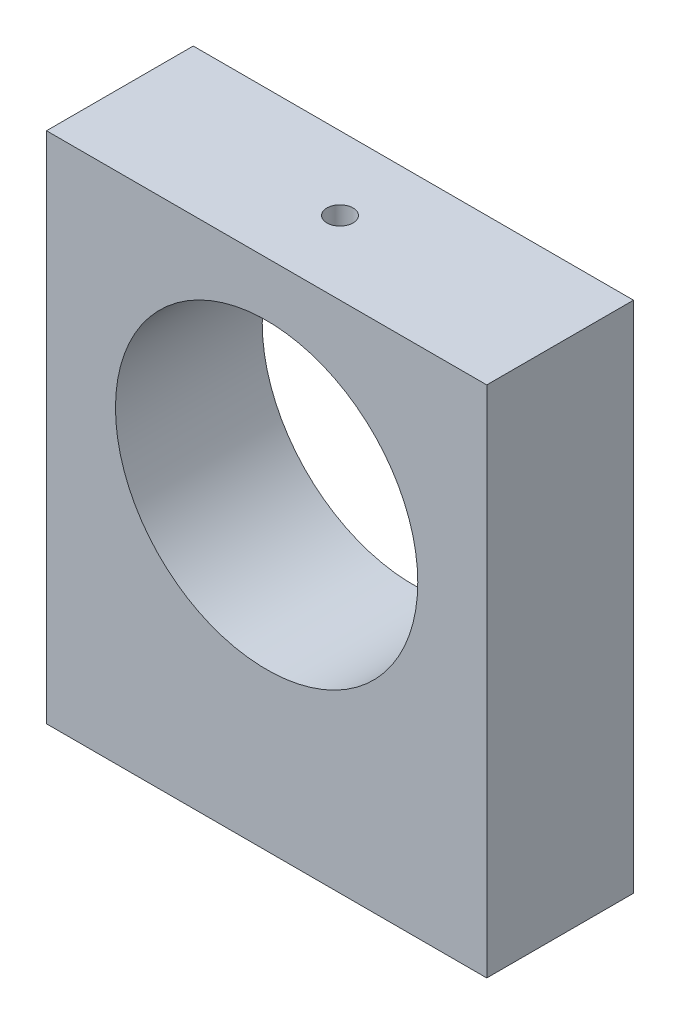
ISO-10303-21;
HEADER;
FILE_DESCRIPTION(('STEP AP214'),'2;1');
FILE_NAME('part.step','',(''),(''),'','','');
FILE_SCHEMA(('AUTOMOTIVE_DESIGN { 1 0 10303 214 1 1 1 1 }'));
ENDSEC;
DATA;
#1=APPLICATION_CONTEXT('core data for automotive mechanical design processes');
#2=APPLICATION_PROTOCOL_DEFINITION('international standard','automotive_design',2000,#1);
#3=PRODUCT_CONTEXT('',#1,'mechanical');
#4=PRODUCT('Part','Part','',(#3));
#5=PRODUCT_RELATED_PRODUCT_CATEGORY('part','',(#4));
#6=PRODUCT_DEFINITION_FORMATION('','',#4);
#7=PRODUCT_DEFINITION_CONTEXT('part definition',#1,'design');
#8=PRODUCT_DEFINITION('design','',#6,#7);
#9=PRODUCT_DEFINITION_SHAPE('','',#8);
#10=(LENGTH_UNIT() NAMED_UNIT(*) SI_UNIT(.MILLI.,.METRE.));
#11=(NAMED_UNIT(*) PLANE_ANGLE_UNIT() SI_UNIT($,.RADIAN.));
#12=(NAMED_UNIT(*) SI_UNIT($,.STERADIAN.) SOLID_ANGLE_UNIT());
#13=UNCERTAINTY_MEASURE_WITH_UNIT(LENGTH_MEASURE(1.E-05),#10,'distance_accuracy_value','');
#14=(GEOMETRIC_REPRESENTATION_CONTEXT(3) GLOBAL_UNCERTAINTY_ASSIGNED_CONTEXT((#13)) GLOBAL_UNIT_ASSIGNED_CONTEXT((#10,
#11,#12)) REPRESENTATION_CONTEXT('',''));
#15=CARTESIAN_POINT('',(0.,0.,0.));
#16=DIRECTION('',(0.,0.,1.));
#17=DIRECTION('',(1.,0.,0.));
#18=AXIS2_PLACEMENT_3D('',#15,#16,#17);
#19=CARTESIAN_POINT('',(19.05,44.45,12.7));
#20=DIRECTION('',(0.,0.,1.));
#21=DIRECTION('',(1.,0.,0.));
#22=AXIS2_PLACEMENT_3D('',#19,#20,#21);
#23=PLANE('',#22);
#24=DIRECTION('',(-1.,0.,0.));
#25=VECTOR('',#24,1.);
#26=CARTESIAN_POINT('',(-19.05,44.45,12.7));
#27=LINE('',#26,#25);
#28=CARTESIAN_POINT('',(19.05,44.45,12.7));
#29=VERTEX_POINT('',#28);
#30=CARTESIAN_POINT('',(-19.05,44.45,12.7));
#31=VERTEX_POINT('',#30);
#32=EDGE_CURVE('E178',#29,#31,#27,.T.);
#33=ORIENTED_EDGE('',*,*,#32,.T.);
#34=DIRECTION('',(0.,-1.,0.));
#35=VECTOR('',#34,1.);
#36=CARTESIAN_POINT('',(-19.05,0.,12.7));
#37=LINE('',#36,#35);
#38=CARTESIAN_POINT('',(-19.05,0.,12.7));
#39=VERTEX_POINT('',#38);
#40=EDGE_CURVE('E85',#31,#39,#37,.T.);
#41=ORIENTED_EDGE('',*,*,#40,.T.);
#42=DIRECTION('',(1.,0.,0.));
#43=VECTOR('',#42,1.);
#44=CARTESIAN_POINT('',(19.05,0.,12.7));
#45=LINE('',#44,#43);
#46=CARTESIAN_POINT('',(19.05,0.,12.7));
#47=VERTEX_POINT('',#46);
#48=EDGE_CURVE('E174',#39,#47,#45,.T.);
#49=ORIENTED_EDGE('',*,*,#48,.T.);
#50=DIRECTION('',(0.,1.,0.));
#51=VECTOR('',#50,1.);
#52=CARTESIAN_POINT('',(19.05,0.,12.7));
#53=LINE('',#52,#51);
#54=EDGE_CURVE('E54',#47,#29,#53,.T.);
#55=ORIENTED_EDGE('',*,*,#54,.T.);
#56=EDGE_LOOP('',(#33,#41,#49,#55));
#57=FACE_BOUND('',#56,.T.);
#58=CARTESIAN_POINT('',(0.,26.67,12.7));
#59=DIRECTION('',(0.,0.,1.));
#60=DIRECTION('',(1.,0.,0.));
#61=AXIS2_PLACEMENT_3D('',#58,#59,#60);
#62=CIRCLE('',#61,13.081);
#63=CARTESIAN_POINT('',(13.081,26.67,12.7));
#64=VERTEX_POINT('',#63);
#65=EDGE_CURVE('E124',#64,#64,#62,.T.);
#66=ORIENTED_EDGE('',*,*,#65,.F.);
#67=EDGE_LOOP('',(#66));
#68=FACE_BOUND('',#67,.T.);
#69=ADVANCED_FACE('F37',(#57,#68),#23,.T.);
#70=CARTESIAN_POINT('',(19.05,44.45,0.));
#71=DIRECTION('',(0.,0.,1.));
#72=DIRECTION('',(1.,0.,0.));
#73=AXIS2_PLACEMENT_3D('',#70,#71,#72);
#74=PLANE('',#73);
#75=DIRECTION('',(-1.,0.,0.));
#76=VECTOR('',#75,1.);
#77=CARTESIAN_POINT('',(-19.05,44.45,0.));
#78=LINE('',#77,#76);
#79=CARTESIAN_POINT('',(19.05,44.45,0.));
#80=VERTEX_POINT('',#79);
#81=CARTESIAN_POINT('',(-19.05,44.45,0.));
#82=VERTEX_POINT('',#81);
#83=EDGE_CURVE('E172',#80,#82,#78,.T.);
#84=ORIENTED_EDGE('',*,*,#83,.F.);
#85=DIRECTION('',(0.,1.,0.));
#86=VECTOR('',#85,1.);
#87=CARTESIAN_POINT('',(19.05,0.,0.));
#88=LINE('',#87,#86);
#89=CARTESIAN_POINT('',(19.05,0.,0.));
#90=VERTEX_POINT('',#89);
#91=EDGE_CURVE('E78',#90,#80,#88,.T.);
#92=ORIENTED_EDGE('',*,*,#91,.F.);
#93=DIRECTION('',(1.,0.,0.));
#94=VECTOR('',#93,1.);
#95=CARTESIAN_POINT('',(19.05,0.,0.));
#96=LINE('',#95,#94);
#97=CARTESIAN_POINT('',(-19.05,0.,0.));
#98=VERTEX_POINT('',#97);
#99=EDGE_CURVE('E72',#98,#90,#96,.T.);
#100=ORIENTED_EDGE('',*,*,#99,.F.);
#101=DIRECTION('',(0.,-1.,0.));
#102=VECTOR('',#101,1.);
#103=CARTESIAN_POINT('',(-19.05,0.,0.));
#104=LINE('',#103,#102);
#105=EDGE_CURVE('E167',#82,#98,#104,.T.);
#106=ORIENTED_EDGE('',*,*,#105,.F.);
#107=EDGE_LOOP('',(#84,#92,#100,#106));
#108=FACE_BOUND('',#107,.T.);
#109=CARTESIAN_POINT('',(0.,26.67,0.));
#110=DIRECTION('',(0.,0.,1.));
#111=DIRECTION('',(1.,0.,0.));
#112=AXIS2_PLACEMENT_3D('',#109,#110,#111);
#113=CIRCLE('',#112,13.081);
#114=CARTESIAN_POINT('',(13.081,26.67,0.));
#115=VERTEX_POINT('',#114);
#116=EDGE_CURVE('E123',#115,#115,#113,.T.);
#117=ORIENTED_EDGE('',*,*,#116,.T.);
#118=EDGE_LOOP('',(#117));
#119=FACE_BOUND('',#118,.T.);
#120=ADVANCED_FACE('F146',(#108,#119),#74,.F.);
#121=CARTESIAN_POINT('',(-19.05,44.45,12.7));
#122=DIRECTION('',(0.,-1.,0.));
#123=DIRECTION('',(1.,0.,0.));
#124=AXIS2_PLACEMENT_3D('',#121,#122,#123);
#125=PLANE('',#124);
#126=CARTESIAN_POINT('',(0.,44.45,6.35));
#127=DIRECTION('',(0.,1.,0.));
#128=DIRECTION('',(0.,0.,1.));
#129=AXIS2_PLACEMENT_3D('',#126,#127,#128);
#130=CIRCLE('',#129,1.1303);
#131=CARTESIAN_POINT('',(0.,44.45,7.4803));
#132=VERTEX_POINT('',#131);
#133=EDGE_CURVE('E113',#132,#132,#130,.T.);
#134=ORIENTED_EDGE('',*,*,#133,.F.);
#135=EDGE_LOOP('',(#134));
#136=FACE_BOUND('',#135,.T.);
#137=ORIENTED_EDGE('',*,*,#83,.T.);
#138=DIRECTION('',(0.,0.,-1.));
#139=VECTOR('',#138,1.);
#140=CARTESIAN_POINT('',(-19.05,44.45,12.7));
#141=LINE('',#140,#139);
#142=EDGE_CURVE('E11',#31,#82,#141,.T.);
#143=ORIENTED_EDGE('',*,*,#142,.F.);
#144=ORIENTED_EDGE('',*,*,#32,.F.);
#145=DIRECTION('',(0.,0.,-1.));
#146=VECTOR('',#145,1.);
#147=CARTESIAN_POINT('',(19.05,44.45,12.7));
#148=LINE('',#147,#146);
#149=EDGE_CURVE('E182',#29,#80,#148,.T.);
#150=ORIENTED_EDGE('',*,*,#149,.T.);
#151=EDGE_LOOP('',(#137,#143,#144,#150));
#152=FACE_BOUND('',#151,.T.);
#153=ADVANCED_FACE('F39',(#136,#152),#125,.F.);
#154=CARTESIAN_POINT('',(-19.05,0.,12.7));
#155=DIRECTION('',(1.,0.,0.));
#156=DIRECTION('',(0.,0.,-1.));
#157=AXIS2_PLACEMENT_3D('',#154,#155,#156);
#158=PLANE('',#157);
#159=ORIENTED_EDGE('',*,*,#105,.T.);
#160=DIRECTION('',(0.,0.,-1.));
#161=VECTOR('',#160,1.);
#162=CARTESIAN_POINT('',(-19.05,0.,12.7));
#163=LINE('',#162,#161);
#164=EDGE_CURVE('E46',#39,#98,#163,.T.);
#165=ORIENTED_EDGE('',*,*,#164,.F.);
#166=ORIENTED_EDGE('',*,*,#40,.F.);
#167=ORIENTED_EDGE('',*,*,#142,.T.);
#168=EDGE_LOOP('',(#159,#165,#166,#167));
#169=FACE_BOUND('',#168,.T.);
#170=ADVANCED_FACE('F160',(#169),#158,.F.);
#171=CARTESIAN_POINT('',(19.05,0.,12.7));
#172=DIRECTION('',(0.,1.,0.));
#173=DIRECTION('',(0.,0.,1.));
#174=AXIS2_PLACEMENT_3D('',#171,#172,#173);
#175=PLANE('',#174);
#176=CARTESIAN_POINT('',(-12.7,0.,6.35));
#177=DIRECTION('',(0.,-1.,0.));
#178=DIRECTION('',(0.,0.,-1.));
#179=AXIS2_PLACEMENT_3D('',#176,#177,#178);
#180=CIRCLE('',#179,2.0193);
#181=CARTESIAN_POINT('',(-12.7,0.,4.3307));
#182=VERTEX_POINT('',#181);
#183=EDGE_CURVE('E103',#182,#182,#180,.T.);
#184=ORIENTED_EDGE('',*,*,#183,.F.);
#185=EDGE_LOOP('',(#184));
#186=FACE_BOUND('',#185,.T.);
#187=CARTESIAN_POINT('',(12.7,0.,6.35));
#188=DIRECTION('',(0.,-1.,0.));
#189=DIRECTION('',(0.,0.,-1.));
#190=AXIS2_PLACEMENT_3D('',#187,#188,#189);
#191=CIRCLE('',#190,2.0193);
#192=CARTESIAN_POINT('',(12.7,0.,4.3307));
#193=VERTEX_POINT('',#192);
#194=EDGE_CURVE('E102',#193,#193,#191,.T.);
#195=ORIENTED_EDGE('',*,*,#194,.F.);
#196=EDGE_LOOP('',(#195));
#197=FACE_BOUND('',#196,.T.);
#198=ORIENTED_EDGE('',*,*,#99,.T.);
#199=DIRECTION('',(0.,0.,-1.));
#200=VECTOR('',#199,1.);
#201=CARTESIAN_POINT('',(19.05,0.,12.7));
#202=LINE('',#201,#200);
#203=EDGE_CURVE('E175',#47,#90,#202,.T.);
#204=ORIENTED_EDGE('',*,*,#203,.F.);
#205=ORIENTED_EDGE('',*,*,#48,.F.);
#206=ORIENTED_EDGE('',*,*,#164,.T.);
#207=EDGE_LOOP('',(#198,#204,#205,#206));
#208=FACE_BOUND('',#207,.T.);
#209=ADVANCED_FACE('F158',(#186,#197,#208),#175,.F.);
#210=CARTESIAN_POINT('',(19.05,0.,12.7));
#211=DIRECTION('',(-1.,0.,0.));
#212=DIRECTION('',(0.,-1.,0.));
#213=AXIS2_PLACEMENT_3D('',#210,#211,#212);
#214=PLANE('',#213);
#215=ORIENTED_EDGE('',*,*,#91,.T.);
#216=ORIENTED_EDGE('',*,*,#149,.F.);
#217=ORIENTED_EDGE('',*,*,#54,.F.);
#218=ORIENTED_EDGE('',*,*,#203,.T.);
#219=EDGE_LOOP('',(#215,#216,#217,#218));
#220=FACE_BOUND('',#219,.T.);
#221=ADVANCED_FACE('F155',(#220),#214,.F.);
#222=CARTESIAN_POINT('',(0.,26.67,12.7));
#223=DIRECTION('',(0.,0.,-1.));
#224=DIRECTION('',(-1.,0.,0.));
#225=AXIS2_PLACEMENT_3D('',#222,#223,#224);
#226=CYLINDRICAL_SURFACE('',#225,13.081);
#227=CARTESIAN_POINT('',(0.,39.751,7.48029999999999));
#228=CARTESIAN_POINT('',(-0.0633626637306998,39.7509993618947,7.48029723629696));
#229=CARTESIAN_POINT('',(-0.126768250046639,39.750534714085,7.47495407326799));
#230=CARTESIAN_POINT('',(-0.251824512633781,39.748725817235,7.45371815356468));
#231=CARTESIAN_POINT('',(-0.313473128226469,39.747380576381,7.43781350117264));
#232=CARTESIAN_POINT('',(-0.433186190447013,39.7439624840104,7.39591849348121));
#233=CARTESIAN_POINT('',(-0.491252666492505,39.7418900490118,7.36993391080716));
#234=CARTESIAN_POINT('',(-0.602186203414241,39.7372498648413,7.3086271313729));
#235=CARTESIAN_POINT('',(-0.655054359818506,39.7346822203725,7.27330690787876));
#236=CARTESIAN_POINT('',(-0.754248453045628,39.7293318206786,7.19422752290937));
#237=CARTESIAN_POINT('',(-0.800558244095319,39.7265485598038,7.15044814120732));
#238=CARTESIAN_POINT('',(-0.885182463980533,39.7210848501785,7.05573598603352));
#239=CARTESIAN_POINT('',(-0.923496538491485,39.7184044059884,7.00480289571745));
#240=CARTESIAN_POINT('',(-0.991096881160476,39.7134444371672,6.89713071595571));
#241=CARTESIAN_POINT('',(-1.0203688768855,39.7111655487808,6.84038263395985));
#242=CARTESIAN_POINT('',(-1.06896297539774,39.7072726026086,6.72275395490748));
#243=CARTESIAN_POINT('',(-1.08828526583679,39.7056585322843,6.66187343581341));
#244=CARTESIAN_POINT('',(-1.11638442923977,39.7032822886666,6.53787041985769));
#245=CARTESIAN_POINT('',(-1.1251877031563,39.7025179829447,6.47475394700565));
#246=CARTESIAN_POINT('',(-1.13208050977311,39.7019210906732,6.34793498853572));
#247=CARTESIAN_POINT('',(-1.13017025727118,39.7020884854437,6.28423251469226));
#248=CARTESIAN_POINT('',(-1.11571204514444,39.7033341409241,6.15823093984742));
#249=CARTESIAN_POINT('',(-1.10319280082242,39.7044099428252,6.09592851616344));
#250=CARTESIAN_POINT('',(-1.06791660423639,39.7073473427345,5.97431255276236));
#251=CARTESIAN_POINT('',(-1.04515954540161,39.7092089489223,5.91499904416558));
#252=CARTESIAN_POINT('',(-0.990021636047844,39.7135110309754,5.80095323033491));
#253=CARTESIAN_POINT('',(-0.957627926770826,39.7159522794076,5.74622717227062));
#254=CARTESIAN_POINT('',(-0.884145519615769,39.721137875926,5.6429780565339));
#255=CARTESIAN_POINT('',(-0.843056632226528,39.7238822306177,5.59445513409565));
#256=CARTESIAN_POINT('',(-0.753189290552118,39.7293757611386,5.50482272992799));
#257=CARTESIAN_POINT('',(-0.704386015844094,39.7321249231838,5.46373812871962));
#258=CARTESIAN_POINT('',(-0.600561767767666,39.7373097297876,5.39034105985675));
#259=CARTESIAN_POINT('',(-0.545540789822525,39.7397453741152,5.35802859865932));
#260=CARTESIAN_POINT('',(-0.430826624612991,39.7440292323025,5.30309449675448));
#261=CARTESIAN_POINT('',(-0.371132893809875,39.7458773776968,5.28047398541021));
#262=CARTESIAN_POINT('',(-0.248775252097617,39.748777234652,5.24558345540227));
#263=CARTESIAN_POINT('',(-0.186111407500314,39.7498289639851,5.23331320576976));
#264=CARTESIAN_POINT('',(-0.0598079618279763,39.7510152064641,5.21950276411328));
#265=CARTESIAN_POINT('',(0.00382785571943772,39.7511526567722,5.21792821133954));
#266=CARTESIAN_POINT('',(0.130458302807624,39.750502704226,5.22546380595072));
#267=CARTESIAN_POINT('',(0.193452938779249,39.7497153106568,5.23457384606578));
#268=CARTESIAN_POINT('',(0.316914656480957,39.747306096978,5.26319154184166));
#269=CARTESIAN_POINT('',(0.377385463437622,39.7456855573673,5.28268324311817));
#270=CARTESIAN_POINT('',(0.494198440541137,39.7417920551924,5.33149465077328));
#271=CARTESIAN_POINT('',(0.550540540660885,39.7395190815654,5.36081452380078));
#272=CARTESIAN_POINT('',(0.65765295497204,39.7345680943203,5.42853614609058));
#273=CARTESIAN_POINT('',(0.70840885004008,39.7318890730626,5.46696062665356));
#274=CARTESIAN_POINT('',(0.802762459116064,39.7264302694399,5.55176793946417));
#275=CARTESIAN_POINT('',(0.846360039359065,39.7236504851932,5.59815092039642));
#276=CARTESIAN_POINT('',(0.925277553262503,39.7182947349741,5.69770783727303));
#277=CARTESIAN_POINT('',(0.960575042278039,39.7157193338492,5.7508995994139));
#278=CARTESIAN_POINT('',(1.02173644433525,39.7110720590108,5.86247556650413));
#279=CARTESIAN_POINT('',(1.04760045761236,39.7090001799474,5.92085971627356));
#280=CARTESIAN_POINT('',(1.08912260340696,39.7055977757832,6.04108410156996));
#281=CARTESIAN_POINT('',(1.10479440956126,39.7042662577801,6.1029195853545));
#282=CARTESIAN_POINT('',(1.12553176947052,39.7024920589394,6.22835626960836));
#283=CARTESIAN_POINT('',(1.1305975439608,39.7020493596034,6.29195743330201));
#284=CARTESIAN_POINT('',(1.12997640610682,39.7021032147222,6.41889701714151));
#285=CARTESIAN_POINT('',(1.12432475753164,39.7025966888673,6.48223561412537));
#286=CARTESIAN_POINT('',(1.10250280429846,39.7044607403054,6.60706037849977));
#287=CARTESIAN_POINT('',(1.08633248423418,39.705831318883,6.66854654317699));
#288=CARTESIAN_POINT('',(1.04394127906148,39.7092943317032,6.78792292310329));
#289=CARTESIAN_POINT('',(1.01772110076156,39.71138671518,6.84581339090577));
#290=CARTESIAN_POINT('',(0.955978356546744,39.7160576682531,6.9563766164067));
#291=CARTESIAN_POINT('',(0.920455920487552,39.7186362310623,7.00904944692707));
#292=CARTESIAN_POINT('',(0.840984457251042,39.7239991106674,7.10786275791815));
#293=CARTESIAN_POINT('',(0.797009278259043,39.7267840490906,7.15398217187202));
#294=CARTESIAN_POINT('',(0.701929055307709,39.7322402027817,7.23820464763562));
#295=CARTESIAN_POINT('',(0.650822291811639,39.7349113904193,7.27630577053616));
#296=CARTESIAN_POINT('',(0.542824057011833,39.7398442502435,7.34346525120707));
#297=CARTESIAN_POINT('',(0.485921379838615,39.7421051046909,7.37250563313923));
#298=CARTESIAN_POINT('',(0.368066450885079,39.7459531180297,7.42058231538712));
#299=CARTESIAN_POINT('',(0.307118929592527,39.747541048397,7.43963007776711));
#300=CARTESIAN_POINT('',(0.204845239581761,39.7494581245988,7.46234702719656));
#301=CARTESIAN_POINT('',(0.164176165578533,39.7500336847566,7.46907040119733));
#302=CARTESIAN_POINT('',(0.0823441036740316,39.7508048292688,7.47804777923904));
#303=CARTESIAN_POINT('',(0.0411811172015384,39.751000414722,7.48030179620571));
#304=CARTESIAN_POINT('',(0.,39.751,7.48029999999999));
#305=B_SPLINE_CURVE_WITH_KNOTS('',3,(#227,#228,#229,#230,#231,#232,#233,#234,#235,#236,#237,
#238,#239,#240,#241,#242,#243,#244,#245,#246,#247,#248,#249,#250,#251,#252,#253,#254,#255,#256,
#257,#258,#259,#260,#261,#262,#263,#264,#265,#266,#267,#268,#269,#270,#271,#272,#273,#274,#275,
#276,#277,#278,#279,#280,#281,#282,#283,#284,#285,#286,#287,#288,#289,#290,#291,#292,#293,#294,
#295,#296,#297,#298,#299,#300,#301,#302,#303,#304),.UNSPECIFIED.,.T.,.F.,(4,2,2,2,2,2,2,2,2,2,2,
2,2,2,2,2,2,2,2,2,2,2,2,2,2,2,2,2,2,2,2,2,2,2,2,2,2,2,4),(0.,0.189937631392694,
0.380089558841023,0.570132749507398,0.760135802992565,0.950598775237018,1.14107018592309,
1.33184072701704,1.5226076700393,1.712894807808,1.90317813048277,2.09294805331554,
2.2827199516083,2.47274621845928,2.66277662735489,2.85343137821949,3.04408626942243,
3.23476337081931,3.42543621709345,3.61549622125879,3.80555431729914,3.99532117404446,
4.1850912486857,4.37534020591128,4.56559271784855,4.75635393109602,4.94711311735054,
5.13761585452735,5.3281146268752,5.51798768435195,5.70786101992892,5.89772100412643,
6.08757833809755,6.27803280900142,6.46853328106534,6.65940932345989,6.8500659395345,
6.97351192523519,7.09695755391976),.UNSPECIFIED.);
#306=CARTESIAN_POINT('',(0.,39.751,7.48029999999999));
#307=VERTEX_POINT('',#306);
#308=EDGE_CURVE('E116',#307,#307,#305,.T.);
#309=ORIENTED_EDGE('',*,*,#308,.F.);
#310=EDGE_LOOP('',(#309));
#311=FACE_BOUND('',#310,.T.);
#312=ORIENTED_EDGE('',*,*,#65,.T.);
#313=EDGE_LOOP('',(#312));
#314=FACE_BOUND('',#313,.T.);
#315=ORIENTED_EDGE('',*,*,#116,.F.);
#316=EDGE_LOOP('',(#315));
#317=FACE_BOUND('',#316,.T.);
#318=ADVANCED_FACE('F133',(#311,#314,#317),#226,.F.);
#319=CARTESIAN_POINT('',(0.,44.45,6.35));
#320=DIRECTION('',(0.,1.,0.));
#321=DIRECTION('',(0.,0.,1.));
#322=AXIS2_PLACEMENT_3D('',#319,#320,#321);
#323=CYLINDRICAL_SURFACE('',#322,1.1303);
#324=ORIENTED_EDGE('',*,*,#133,.T.);
#325=EDGE_LOOP('',(#324));
#326=FACE_BOUND('',#325,.T.);
#327=ORIENTED_EDGE('',*,*,#308,.T.);
#328=EDGE_LOOP('',(#327));
#329=FACE_BOUND('',#328,.T.);
#330=ADVANCED_FACE('F128',(#326,#329),#323,.F.);
#331=CARTESIAN_POINT('',(12.7,12.7,6.35));
#332=DIRECTION('',(0.,-1.,0.));
#333=DIRECTION('',(0.,0.,-1.));
#334=AXIS2_PLACEMENT_3D('',#331,#332,#333);
#335=CONICAL_SURFACE('',#334,2.0193,1.02974425867665);
#336=CARTESIAN_POINT('',(12.7,13.9133178480024,6.35));
#337=VERTEX_POINT('',#336);
#338=VERTEX_LOOP('',#337);
#339=FACE_BOUND('',#338,.T.);
#340=CARTESIAN_POINT('',(12.7,12.7,6.35));
#341=DIRECTION('',(0.,-1.,0.));
#342=DIRECTION('',(0.,0.,-1.));
#343=AXIS2_PLACEMENT_3D('',#340,#341,#342);
#344=CIRCLE('',#343,2.0193);
#345=CARTESIAN_POINT('',(12.7,12.7,4.3307));
#346=VERTEX_POINT('',#345);
#347=EDGE_CURVE('E106',#346,#346,#344,.T.);
#348=ORIENTED_EDGE('',*,*,#347,.T.);
#349=EDGE_LOOP('',(#348));
#350=FACE_BOUND('',#349,.T.);
#351=ADVANCED_FACE('F132',(#339,#350),#335,.F.);
#352=CARTESIAN_POINT('',(12.7,0.,6.35));
#353=DIRECTION('',(0.,-1.,0.));
#354=DIRECTION('',(0.,0.,-1.));
#355=AXIS2_PLACEMENT_3D('',#352,#353,#354);
#356=CYLINDRICAL_SURFACE('',#355,2.0193);
#357=ORIENTED_EDGE('',*,*,#347,.F.);
#358=EDGE_LOOP('',(#357));
#359=FACE_BOUND('',#358,.T.);
#360=ORIENTED_EDGE('',*,*,#194,.T.);
#361=EDGE_LOOP('',(#360));
#362=FACE_BOUND('',#361,.T.);
#363=ADVANCED_FACE('F96',(#359,#362),#356,.F.);
#364=CARTESIAN_POINT('',(-12.7,12.7,6.35));
#365=DIRECTION('',(0.,-1.,0.));
#366=DIRECTION('',(0.,0.,-1.));
#367=AXIS2_PLACEMENT_3D('',#364,#365,#366);
#368=CONICAL_SURFACE('',#367,2.0193,1.02974425867665);
#369=CARTESIAN_POINT('',(-12.7,13.9133178480024,6.35));
#370=VERTEX_POINT('',#369);
#371=VERTEX_LOOP('',#370);
#372=FACE_BOUND('',#371,.T.);
#373=CARTESIAN_POINT('',(-12.7,12.7,6.35));
#374=DIRECTION('',(0.,-1.,0.));
#375=DIRECTION('',(0.,0.,-1.));
#376=AXIS2_PLACEMENT_3D('',#373,#374,#375);
#377=CIRCLE('',#376,2.0193);
#378=CARTESIAN_POINT('',(-12.7,12.7,4.3307));
#379=VERTEX_POINT('',#378);
#380=EDGE_CURVE('E100',#379,#379,#377,.T.);
#381=ORIENTED_EDGE('',*,*,#380,.T.);
#382=EDGE_LOOP('',(#381));
#383=FACE_BOUND('',#382,.T.);
#384=ADVANCED_FACE('F92',(#372,#383),#368,.F.);
#385=CARTESIAN_POINT('',(-12.7,0.,6.35));
#386=DIRECTION('',(0.,-1.,0.));
#387=DIRECTION('',(0.,0.,-1.));
#388=AXIS2_PLACEMENT_3D('',#385,#386,#387);
#389=CYLINDRICAL_SURFACE('',#388,2.0193);
#390=ORIENTED_EDGE('',*,*,#380,.F.);
#391=EDGE_LOOP('',(#390));
#392=FACE_BOUND('',#391,.T.);
#393=ORIENTED_EDGE('',*,*,#183,.T.);
#394=EDGE_LOOP('',(#393));
#395=FACE_BOUND('',#394,.T.);
#396=ADVANCED_FACE('F95',(#392,#395),#389,.F.);
#397=CLOSED_SHELL('',(#69,#120,#153,#170,#209,#221,#318,#330,#351,#363,#384,#396));
#398=MANIFOLD_SOLID_BREP('B2',#397);
#399=ADVANCED_BREP_SHAPE_REPRESENTATION('',(#18,#398),#14);
#400=SHAPE_DEFINITION_REPRESENTATION(#9,#399);
ENDSEC;
END-ISO-10303-21;
